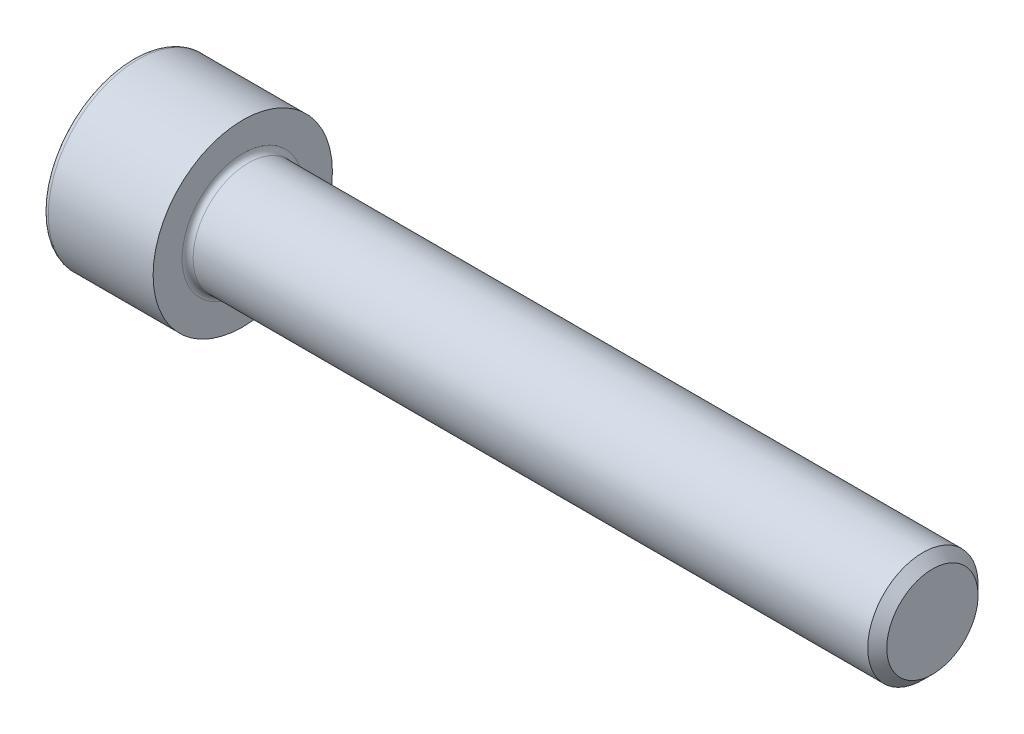
ISO-10303-21;
HEADER;
FILE_DESCRIPTION(('STEP AP214'),'2;1');
FILE_NAME('part.step','',(''),(''),'','','');
FILE_SCHEMA(('AUTOMOTIVE_DESIGN { 1 0 10303 214 1 1 1 1 }'));
ENDSEC;
DATA;
#1=APPLICATION_CONTEXT('core data for automotive mechanical design processes');
#2=APPLICATION_PROTOCOL_DEFINITION('international standard','automotive_design',2000,#1);
#3=PRODUCT_CONTEXT('',#1,'mechanical');
#4=PRODUCT('Part','Part','',(#3));
#5=PRODUCT_RELATED_PRODUCT_CATEGORY('part','',(#4));
#6=PRODUCT_DEFINITION_FORMATION('','',#4);
#7=PRODUCT_DEFINITION_CONTEXT('part definition',#1,'design');
#8=PRODUCT_DEFINITION('design','',#6,#7);
#9=PRODUCT_DEFINITION_SHAPE('','',#8);
#10=(LENGTH_UNIT() NAMED_UNIT(*) SI_UNIT(.MILLI.,.METRE.));
#11=(NAMED_UNIT(*) PLANE_ANGLE_UNIT() SI_UNIT($,.RADIAN.));
#12=(NAMED_UNIT(*) SI_UNIT($,.STERADIAN.) SOLID_ANGLE_UNIT());
#13=UNCERTAINTY_MEASURE_WITH_UNIT(LENGTH_MEASURE(1.E-05),#10,'distance_accuracy_value','');
#14=(GEOMETRIC_REPRESENTATION_CONTEXT(3) GLOBAL_UNCERTAINTY_ASSIGNED_CONTEXT((#13)) GLOBAL_UNIT_ASSIGNED_CONTEXT((#10,
#11,#12)) REPRESENTATION_CONTEXT('',''));
#15=CARTESIAN_POINT('',(0.,0.,0.));
#16=DIRECTION('',(0.,0.,1.));
#17=DIRECTION('',(1.,0.,0.));
#18=AXIS2_PLACEMENT_3D('',#15,#16,#17);
#19=CARTESIAN_POINT('',(0.,0.,0.));
#20=DIRECTION('',(-1.,0.,0.));
#21=DIRECTION('',(0.,0.,1.));
#22=AXIS2_PLACEMENT_3D('',#19,#20,#21);
#23=PLANE('',#22);
#24=DIRECTION('',(0.,-0.499999999999999,0.866025403784439));
#25=VECTOR('',#24,1.);
#26=CARTESIAN_POINT('',(0.,3.51894989071077,0.));
#27=LINE('',#26,#25);
#28=CARTESIAN_POINT('',(0.,3.51894989071077,0.));
#29=VERTEX_POINT('',#28);
#30=CARTESIAN_POINT('',(0.,1.75947494535539,3.04749999999999));
#31=VERTEX_POINT('',#30);
#32=EDGE_CURVE('E375',#29,#31,#27,.T.);
#33=ORIENTED_EDGE('',*,*,#32,.T.);
#34=DIRECTION('',(0.,1.,0.));
#35=VECTOR('',#34,1.);
#36=CARTESIAN_POINT('',(0.,-1.75947494535538,3.0475));
#37=LINE('',#36,#35);
#38=CARTESIAN_POINT('',(0.,-1.75947494535538,3.0475));
#39=VERTEX_POINT('',#38);
#40=EDGE_CURVE('E132',#39,#31,#37,.T.);
#41=ORIENTED_EDGE('',*,*,#40,.F.);
#42=DIRECTION('',(0.,-0.500000000000001,-0.866025403784438));
#43=VECTOR('',#42,1.);
#44=CARTESIAN_POINT('',(0.,-1.75947494535538,3.0475));
#45=LINE('',#44,#43);
#46=CARTESIAN_POINT('',(0.,-3.51894989071077,0.));
#47=VERTEX_POINT('',#46);
#48=EDGE_CURVE('E378',#39,#47,#45,.T.);
#49=ORIENTED_EDGE('',*,*,#48,.T.);
#50=DIRECTION('',(0.,0.499999999999999,-0.866025403784439));
#51=VECTOR('',#50,1.);
#52=CARTESIAN_POINT('',(0.,-3.51894989071077,0.));
#53=LINE('',#52,#51);
#54=CARTESIAN_POINT('',(0.,-1.75947494535539,-3.0475));
#55=VERTEX_POINT('',#54);
#56=EDGE_CURVE('E381',#47,#55,#53,.T.);
#57=ORIENTED_EDGE('',*,*,#56,.T.);
#58=DIRECTION('',(0.,-1.,0.));
#59=VECTOR('',#58,1.);
#60=CARTESIAN_POINT('',(0.,1.75947494535538,-3.04750000000001));
#61=LINE('',#60,#59);
#62=CARTESIAN_POINT('',(0.,1.75947494535538,-3.04750000000001));
#63=VERTEX_POINT('',#62);
#64=EDGE_CURVE('E384',#63,#55,#61,.T.);
#65=ORIENTED_EDGE('',*,*,#64,.F.);
#66=DIRECTION('',(0.,-0.500000000000001,-0.866025403784438));
#67=VECTOR('',#66,1.);
#68=CARTESIAN_POINT('',(0.,3.51894989071077,0.));
#69=LINE('',#68,#67);
#70=EDGE_CURVE('E127',#29,#63,#69,.T.);
#71=ORIENTED_EDGE('',*,*,#70,.F.);
#72=EDGE_LOOP('',(#33,#41,#49,#57,#65,#71));
#73=FACE_BOUND('',#72,.T.);
#74=CARTESIAN_POINT('',(0.,0.,0.));
#75=DIRECTION('',(-1.,0.,0.));
#76=DIRECTION('',(0.,0.,1.));
#77=AXIS2_PLACEMENT_3D('',#74,#75,#76);
#78=CIRCLE('',#77,6.1);
#79=CARTESIAN_POINT('',(0.,0.,6.1));
#80=VERTEX_POINT('',#79);
#81=EDGE_CURVE('E44',#80,#80,#78,.T.);
#82=ORIENTED_EDGE('',*,*,#81,.T.);
#83=EDGE_LOOP('',(#82));
#84=FACE_BOUND('',#83,.T.);
#85=ADVANCED_FACE('F36',(#73,#84),#23,.T.);
#86=CARTESIAN_POINT('',(58.,3.3095,0.));
#87=DIRECTION('',(1.,0.,0.));
#88=DIRECTION('',(0.,0.,-1.));
#89=AXIS2_PLACEMENT_3D('',#86,#87,#88);
#90=PLANE('',#89);
#91=CARTESIAN_POINT('',(58.,0.,0.));
#92=DIRECTION('',(-1.,0.,0.));
#93=DIRECTION('',(0.,0.,1.));
#94=AXIS2_PLACEMENT_3D('',#91,#92,#93);
#95=CIRCLE('',#94,3.3095);
#96=CARTESIAN_POINT('',(58.,0.,3.3095));
#97=VERTEX_POINT('',#96);
#98=EDGE_CURVE('E150',#97,#97,#95,.T.);
#99=ORIENTED_EDGE('',*,*,#98,.F.);
#100=EDGE_LOOP('',(#99));
#101=FACE_BOUND('',#100,.T.);
#102=ADVANCED_FACE('F174',(#101),#90,.T.);
#103=CARTESIAN_POINT('',(58.,0.,0.));
#104=DIRECTION('',(-1.,0.,0.));
#105=DIRECTION('',(0.,0.,1.));
#106=AXIS2_PLACEMENT_3D('',#103,#104,#105);
#107=CONICAL_SURFACE('',#106,3.3095,0.785398163397379);
#108=CARTESIAN_POINT('',(57.3095,0.,0.));
#109=DIRECTION('',(-1.,0.,0.));
#110=DIRECTION('',(0.,0.,1.));
#111=AXIS2_PLACEMENT_3D('',#108,#109,#110);
#112=CIRCLE('',#111,3.99999999999994);
#113=CARTESIAN_POINT('',(57.3095,0.,3.99999999999994));
#114=VERTEX_POINT('',#113);
#115=EDGE_CURVE('E147',#114,#114,#112,.T.);
#116=ORIENTED_EDGE('',*,*,#115,.F.);
#117=EDGE_LOOP('',(#116));
#118=FACE_BOUND('',#117,.T.);
#119=ORIENTED_EDGE('',*,*,#98,.T.);
#120=EDGE_LOOP('',(#119));
#121=FACE_BOUND('',#120,.T.);
#122=ADVANCED_FACE('F180',(#118,#121),#107,.T.);
#123=CARTESIAN_POINT('',(-31.75,0.,0.));
#124=DIRECTION('',(-1.,0.,0.));
#125=DIRECTION('',(0.,0.,1.));
#126=AXIS2_PLACEMENT_3D('',#123,#124,#125);
#127=CYLINDRICAL_SURFACE('',#126,3.99999999999997);
#128=CARTESIAN_POINT('',(8.4,0.,0.));
#129=DIRECTION('',(1.,0.,0.));
#130=DIRECTION('',(0.,0.,-1.));
#131=AXIS2_PLACEMENT_3D('',#128,#129,#130);
#132=CIRCLE('',#131,3.99999999999997);
#133=CARTESIAN_POINT('',(8.4,0.,-3.99999999999997));
#134=VERTEX_POINT('',#133);
#135=EDGE_CURVE('E156',#134,#134,#132,.T.);
#136=ORIENTED_EDGE('',*,*,#135,.T.);
#137=EDGE_LOOP('',(#136));
#138=FACE_BOUND('',#137,.T.);
#139=ORIENTED_EDGE('',*,*,#115,.T.);
#140=EDGE_LOOP('',(#139));
#141=FACE_BOUND('',#140,.T.);
#142=ADVANCED_FACE('F192',(#138,#141),#127,.T.);
#143=CARTESIAN_POINT('',(8.,6.5,0.));
#144=DIRECTION('',(1.,0.,0.));
#145=DIRECTION('',(0.,0.,-1.));
#146=AXIS2_PLACEMENT_3D('',#143,#144,#145);
#147=PLANE('',#146);
#148=CARTESIAN_POINT('',(8.,0.,0.));
#149=DIRECTION('',(1.,0.,0.));
#150=DIRECTION('',(0.,0.,-1.));
#151=AXIS2_PLACEMENT_3D('',#148,#149,#150);
#152=CIRCLE('',#151,4.39999999999997);
#153=CARTESIAN_POINT('',(8.,0.,-4.39999999999997));
#154=VERTEX_POINT('',#153);
#155=EDGE_CURVE('E153',#154,#154,#152,.F.);
#156=ORIENTED_EDGE('',*,*,#155,.T.);
#157=EDGE_LOOP('',(#156));
#158=FACE_BOUND('',#157,.T.);
#159=CARTESIAN_POINT('',(8.00000000000001,0.,0.));
#160=DIRECTION('',(-1.,0.,0.));
#161=DIRECTION('',(0.,0.,1.));
#162=AXIS2_PLACEMENT_3D('',#159,#160,#161);
#163=CIRCLE('',#162,6.5);
#164=CARTESIAN_POINT('',(8.00000000000001,0.,6.5));
#165=VERTEX_POINT('',#164);
#166=EDGE_CURVE('E143',#165,#165,#163,.T.);
#167=ORIENTED_EDGE('',*,*,#166,.F.);
#168=EDGE_LOOP('',(#167));
#169=FACE_BOUND('',#168,.T.);
#170=ADVANCED_FACE('F188',(#158,#169),#147,.T.);
#171=CARTESIAN_POINT('',(-31.75,0.,0.));
#172=DIRECTION('',(-1.,0.,0.));
#173=DIRECTION('',(0.,0.,1.));
#174=AXIS2_PLACEMENT_3D('',#171,#172,#173);
#175=CYLINDRICAL_SURFACE('',#174,6.5);
#176=CARTESIAN_POINT('',(0.399999999999998,0.,0.));
#177=DIRECTION('',(-1.,0.,0.));
#178=DIRECTION('',(0.,0.,1.));
#179=AXIS2_PLACEMENT_3D('',#176,#177,#178);
#180=CIRCLE('',#179,6.5);
#181=CARTESIAN_POINT('',(0.399999999999998,0.,6.5));
#182=VERTEX_POINT('',#181);
#183=EDGE_CURVE('E11',#182,#182,#180,.F.);
#184=ORIENTED_EDGE('',*,*,#183,.T.);
#185=EDGE_LOOP('',(#184));
#186=FACE_BOUND('',#185,.T.);
#187=ORIENTED_EDGE('',*,*,#166,.T.);
#188=EDGE_LOOP('',(#187));
#189=FACE_BOUND('',#188,.T.);
#190=ADVANCED_FACE('F170',(#186,#189),#175,.T.);
#191=CARTESIAN_POINT('',(8.4,0.,0.));
#192=DIRECTION('',(1.,0.,0.));
#193=DIRECTION('',(0.,0.,-1.));
#194=AXIS2_PLACEMENT_3D('',#191,#192,#193);
#195=TOROIDAL_SURFACE('',#194,4.39999999999997,0.4);
#196=ORIENTED_EDGE('',*,*,#135,.F.);
#197=EDGE_LOOP('',(#196));
#198=FACE_BOUND('',#197,.T.);
#199=ORIENTED_EDGE('',*,*,#155,.F.);
#200=EDGE_LOOP('',(#199));
#201=FACE_BOUND('',#200,.T.);
#202=ADVANCED_FACE('F163',(#198,#201),#195,.F.);
#203=CARTESIAN_POINT('',(0.399999999999998,0.,0.));
#204=DIRECTION('',(-1.,0.,0.));
#205=DIRECTION('',(0.,0.,1.));
#206=AXIS2_PLACEMENT_3D('',#203,#204,#205);
#207=TOROIDAL_SURFACE('',#206,6.1,0.4);
#208=ORIENTED_EDGE('',*,*,#183,.F.);
#209=EDGE_LOOP('',(#208));
#210=FACE_BOUND('',#209,.T.);
#211=ORIENTED_EDGE('',*,*,#81,.F.);
#212=EDGE_LOOP('',(#211));
#213=FACE_BOUND('',#212,.T.);
#214=ADVANCED_FACE('F38',(#210,#213),#207,.T.);
#215=CARTESIAN_POINT('',(4.,3.51894989071077,0.));
#216=DIRECTION('',(0.,-0.866025403784439,-0.499999999999999));
#217=DIRECTION('',(0.,0.499999999999999,-0.866025403784439));
#218=AXIS2_PLACEMENT_3D('',#215,#216,#217);
#219=PLANE('',#218);
#220=ORIENTED_EDGE('',*,*,#32,.F.);
#221=DIRECTION('',(-1.,0.,0.));
#222=VECTOR('',#221,1.);
#223=CARTESIAN_POINT('',(4.,3.51894989071077,0.));
#224=LINE('',#223,#222);
#225=CARTESIAN_POINT('',(4.,3.51894989071077,0.));
#226=VERTEX_POINT('',#225);
#227=EDGE_CURVE('E365',#226,#29,#224,.T.);
#228=ORIENTED_EDGE('',*,*,#227,.F.);
#229=DIRECTION('',(0.,-0.499999999999999,0.866025403784439));
#230=VECTOR('',#229,1.);
#231=CARTESIAN_POINT('',(4.,3.51894989071077,0.));
#232=LINE('',#231,#230);
#233=CARTESIAN_POINT('',(4.,2.63921241803307,1.52374999999999));
#234=VERTEX_POINT('',#233);
#235=EDGE_CURVE('E119',#226,#234,#232,.T.);
#236=ORIENTED_EDGE('',*,*,#235,.T.);
#237=CARTESIAN_POINT('',(4.,1.75947494535539,3.04749999999999));
#238=VERTEX_POINT('',#237);
#239=EDGE_CURVE('E110',#234,#238,#232,.T.);
#240=ORIENTED_EDGE('',*,*,#239,.T.);
#241=DIRECTION('',(-1.,0.,0.));
#242=VECTOR('',#241,1.);
#243=CARTESIAN_POINT('',(4.,1.75947494535539,3.04749999999999));
#244=LINE('',#243,#242);
#245=EDGE_CURVE('E124',#238,#31,#244,.T.);
#246=ORIENTED_EDGE('',*,*,#245,.T.);
#247=EDGE_LOOP('',(#220,#228,#236,#240,#246));
#248=FACE_BOUND('',#247,.T.);
#249=ADVANCED_FACE('F123',(#248),#219,.T.);
#250=CARTESIAN_POINT('',(4.,-1.75947494535538,3.0475));
#251=DIRECTION('',(0.,0.,1.));
#252=DIRECTION('',(0.,-1.,0.));
#253=AXIS2_PLACEMENT_3D('',#250,#251,#252);
#254=PLANE('',#253);
#255=ORIENTED_EDGE('',*,*,#40,.T.);
#256=ORIENTED_EDGE('',*,*,#245,.F.);
#257=DIRECTION('',(0.,1.,0.));
#258=VECTOR('',#257,1.);
#259=CARTESIAN_POINT('',(4.,-1.75947494535538,3.0475));
#260=LINE('',#259,#258);
#261=CARTESIAN_POINT('',(4.,0.,3.0475));
#262=VERTEX_POINT('',#261);
#263=EDGE_CURVE('E107',#262,#238,#260,.T.);
#264=ORIENTED_EDGE('',*,*,#263,.F.);
#265=CARTESIAN_POINT('',(4.,-1.75947494535538,3.0475));
#266=VERTEX_POINT('',#265);
#267=EDGE_CURVE('E118',#266,#262,#260,.T.);
#268=ORIENTED_EDGE('',*,*,#267,.F.);
#269=DIRECTION('',(-1.,0.,0.));
#270=VECTOR('',#269,1.);
#271=CARTESIAN_POINT('',(4.,-1.75947494535538,3.0475));
#272=LINE('',#271,#270);
#273=EDGE_CURVE('E134',#266,#39,#272,.T.);
#274=ORIENTED_EDGE('',*,*,#273,.T.);
#275=EDGE_LOOP('',(#255,#256,#264,#268,#274));
#276=FACE_BOUND('',#275,.T.);
#277=ADVANCED_FACE('F129',(#276),#254,.F.);
#278=CARTESIAN_POINT('',(4.,-1.75947494535538,3.0475));
#279=DIRECTION('',(0.,0.866025403784438,-0.500000000000001));
#280=DIRECTION('',(0.,0.500000000000001,0.866025403784438));
#281=AXIS2_PLACEMENT_3D('',#278,#279,#280);
#282=PLANE('',#281);
#283=ORIENTED_EDGE('',*,*,#48,.F.);
#284=ORIENTED_EDGE('',*,*,#273,.F.);
#285=DIRECTION('',(0.,-0.500000000000001,-0.866025403784438));
#286=VECTOR('',#285,1.);
#287=CARTESIAN_POINT('',(4.,-1.75947494535538,3.0475));
#288=LINE('',#287,#286);
#289=CARTESIAN_POINT('',(4.,-2.63921241803308,1.52375));
#290=VERTEX_POINT('',#289);
#291=EDGE_CURVE('E404',#266,#290,#288,.T.);
#292=ORIENTED_EDGE('',*,*,#291,.T.);
#293=CARTESIAN_POINT('',(4.,-3.51894989071077,0.));
#294=VERTEX_POINT('',#293);
#295=EDGE_CURVE('E393',#290,#294,#288,.T.);
#296=ORIENTED_EDGE('',*,*,#295,.T.);
#297=DIRECTION('',(-1.,0.,0.));
#298=VECTOR('',#297,1.);
#299=CARTESIAN_POINT('',(4.,-3.51894989071077,0.));
#300=LINE('',#299,#298);
#301=EDGE_CURVE('E139',#294,#47,#300,.T.);
#302=ORIENTED_EDGE('',*,*,#301,.T.);
#303=EDGE_LOOP('',(#283,#284,#292,#296,#302));
#304=FACE_BOUND('',#303,.T.);
#305=ADVANCED_FACE('F256',(#304),#282,.T.);
#306=CARTESIAN_POINT('',(4.,-3.51894989071077,0.));
#307=DIRECTION('',(0.,0.866025403784439,0.499999999999999));
#308=DIRECTION('',(0.,-0.499999999999999,0.866025403784439));
#309=AXIS2_PLACEMENT_3D('',#306,#307,#308);
#310=PLANE('',#309);
#311=ORIENTED_EDGE('',*,*,#56,.F.);
#312=ORIENTED_EDGE('',*,*,#301,.F.);
#313=DIRECTION('',(0.,0.499999999999999,-0.866025403784439));
#314=VECTOR('',#313,1.);
#315=CARTESIAN_POINT('',(4.,-3.51894989071077,0.));
#316=LINE('',#315,#314);
#317=CARTESIAN_POINT('',(4.,-2.63921241803308,-1.52375));
#318=VERTEX_POINT('',#317);
#319=EDGE_CURVE('E371',#294,#318,#316,.T.);
#320=ORIENTED_EDGE('',*,*,#319,.T.);
#321=CARTESIAN_POINT('',(4.,-1.75947494535539,-3.0475));
#322=VERTEX_POINT('',#321);
#323=EDGE_CURVE('E403',#318,#322,#316,.T.);
#324=ORIENTED_EDGE('',*,*,#323,.T.);
#325=DIRECTION('',(-1.,0.,0.));
#326=VECTOR('',#325,1.);
#327=CARTESIAN_POINT('',(4.,-1.75947494535539,-3.0475));
#328=LINE('',#327,#326);
#329=EDGE_CURVE('E364',#322,#55,#328,.T.);
#330=ORIENTED_EDGE('',*,*,#329,.T.);
#331=EDGE_LOOP('',(#311,#312,#320,#324,#330));
#332=FACE_BOUND('',#331,.T.);
#333=ADVANCED_FACE('F264',(#332),#310,.T.);
#334=CARTESIAN_POINT('',(4.,1.75947494535538,-3.04750000000001));
#335=DIRECTION('',(0.,0.,-1.));
#336=DIRECTION('',(0.,1.,0.));
#337=AXIS2_PLACEMENT_3D('',#334,#335,#336);
#338=PLANE('',#337);
#339=ORIENTED_EDGE('',*,*,#64,.T.);
#340=ORIENTED_EDGE('',*,*,#329,.F.);
#341=DIRECTION('',(0.,-1.,0.));
#342=VECTOR('',#341,1.);
#343=CARTESIAN_POINT('',(4.,1.75947494535538,-3.04750000000001));
#344=LINE('',#343,#342);
#345=CARTESIAN_POINT('',(4.,0.,-3.0475));
#346=VERTEX_POINT('',#345);
#347=EDGE_CURVE('E368',#346,#322,#344,.T.);
#348=ORIENTED_EDGE('',*,*,#347,.F.);
#349=CARTESIAN_POINT('',(4.,1.75947494535538,-3.04750000000001));
#350=VERTEX_POINT('',#349);
#351=EDGE_CURVE('E51',#350,#346,#344,.T.);
#352=ORIENTED_EDGE('',*,*,#351,.F.);
#353=DIRECTION('',(-1.,0.,0.));
#354=VECTOR('',#353,1.);
#355=CARTESIAN_POINT('',(4.,1.75947494535538,-3.04750000000001));
#356=LINE('',#355,#354);
#357=EDGE_CURVE('E361',#350,#63,#356,.T.);
#358=ORIENTED_EDGE('',*,*,#357,.T.);
#359=EDGE_LOOP('',(#339,#340,#348,#352,#358));
#360=FACE_BOUND('',#359,.T.);
#361=ADVANCED_FACE('F273',(#360),#338,.F.);
#362=CARTESIAN_POINT('',(4.,3.51894989071077,0.));
#363=DIRECTION('',(0.,0.866025403784438,-0.500000000000001));
#364=DIRECTION('',(0.,0.500000000000001,0.866025403784438));
#365=AXIS2_PLACEMENT_3D('',#362,#363,#364);
#366=PLANE('',#365);
#367=ORIENTED_EDGE('',*,*,#70,.T.);
#368=ORIENTED_EDGE('',*,*,#357,.F.);
#369=DIRECTION('',(0.,-0.500000000000001,-0.866025403784438));
#370=VECTOR('',#369,1.);
#371=CARTESIAN_POINT('',(4.,3.51894989071077,0.));
#372=LINE('',#371,#370);
#373=CARTESIAN_POINT('',(4.,2.63921241803307,-1.52375));
#374=VERTEX_POINT('',#373);
#375=EDGE_CURVE('E351',#374,#350,#372,.T.);
#376=ORIENTED_EDGE('',*,*,#375,.F.);
#377=EDGE_CURVE('E357',#226,#374,#372,.T.);
#378=ORIENTED_EDGE('',*,*,#377,.F.);
#379=ORIENTED_EDGE('',*,*,#227,.T.);
#380=EDGE_LOOP('',(#367,#368,#376,#378,#379));
#381=FACE_BOUND('',#380,.T.);
#382=ADVANCED_FACE('F282',(#381),#366,.F.);
#383=CARTESIAN_POINT('',(4.,5.27842483606615,-3.04750000000001));
#384=DIRECTION('',(1.,0.,0.));
#385=DIRECTION('',(0.,0.,-1.));
#386=AXIS2_PLACEMENT_3D('',#383,#384,#385);
#387=PLANE('',#386);
#388=ORIENTED_EDGE('',*,*,#347,.T.);
#389=ORIENTED_EDGE('',*,*,#323,.F.);
#390=CARTESIAN_POINT('',(4.,0.,0.));
#391=DIRECTION('',(-1.,0.,0.));
#392=DIRECTION('',(0.,0.,1.));
#393=AXIS2_PLACEMENT_3D('',#390,#391,#392);
#394=CIRCLE('',#393,3.0475);
#395=EDGE_CURVE('E399',#346,#318,#394,.T.);
#396=ORIENTED_EDGE('',*,*,#395,.F.);
#397=EDGE_LOOP('',(#388,#389,#396));
#398=FACE_BOUND('',#397,.T.);
#399=ADVANCED_FACE('F291',(#398),#387,.F.);
#400=ORIENTED_EDGE('',*,*,#319,.F.);
#401=ORIENTED_EDGE('',*,*,#295,.F.);
#402=EDGE_CURVE('E137',#318,#290,#394,.T.);
#403=ORIENTED_EDGE('',*,*,#402,.F.);
#404=EDGE_LOOP('',(#400,#401,#403));
#405=FACE_BOUND('',#404,.T.);
#406=ADVANCED_FACE('F300',(#405),#387,.F.);
#407=ORIENTED_EDGE('',*,*,#291,.F.);
#408=ORIENTED_EDGE('',*,*,#267,.T.);
#409=EDGE_CURVE('E133',#290,#262,#394,.T.);
#410=ORIENTED_EDGE('',*,*,#409,.F.);
#411=EDGE_LOOP('',(#407,#408,#410));
#412=FACE_BOUND('',#411,.T.);
#413=ADVANCED_FACE('F309',(#412),#387,.F.);
#414=ORIENTED_EDGE('',*,*,#263,.T.);
#415=ORIENTED_EDGE('',*,*,#239,.F.);
#416=EDGE_CURVE('E113',#262,#234,#394,.T.);
#417=ORIENTED_EDGE('',*,*,#416,.F.);
#418=EDGE_LOOP('',(#414,#415,#417));
#419=FACE_BOUND('',#418,.T.);
#420=ADVANCED_FACE('F109',(#419),#387,.F.);
#421=ORIENTED_EDGE('',*,*,#235,.F.);
#422=ORIENTED_EDGE('',*,*,#377,.T.);
#423=EDGE_CURVE('E144',#234,#374,#394,.T.);
#424=ORIENTED_EDGE('',*,*,#423,.F.);
#425=EDGE_LOOP('',(#421,#422,#424));
#426=FACE_BOUND('',#425,.T.);
#427=ADVANCED_FACE('F324',(#426),#387,.F.);
#428=ORIENTED_EDGE('',*,*,#375,.T.);
#429=ORIENTED_EDGE('',*,*,#351,.T.);
#430=EDGE_CURVE('E354',#374,#346,#394,.T.);
#431=ORIENTED_EDGE('',*,*,#430,.F.);
#432=EDGE_LOOP('',(#428,#429,#431));
#433=FACE_BOUND('',#432,.T.);
#434=ADVANCED_FACE('F239',(#433),#387,.F.);
#435=CARTESIAN_POINT('',(4.,0.,0.));
#436=DIRECTION('',(-1.,0.,0.));
#437=DIRECTION('',(0.,0.,1.));
#438=AXIS2_PLACEMENT_3D('',#435,#436,#437);
#439=CONICAL_SURFACE('',#438,3.0475,1.04719755119659);
#440=CARTESIAN_POINT('',(5.75947494535541,0.,0.));
#441=VERTEX_POINT('',#440);
#442=VERTEX_LOOP('',#441);
#443=FACE_BOUND('',#442,.T.);
#444=ORIENTED_EDGE('',*,*,#416,.T.);
#445=ORIENTED_EDGE('',*,*,#423,.T.);
#446=ORIENTED_EDGE('',*,*,#430,.T.);
#447=ORIENTED_EDGE('',*,*,#395,.T.);
#448=ORIENTED_EDGE('',*,*,#402,.T.);
#449=ORIENTED_EDGE('',*,*,#409,.T.);
#450=EDGE_LOOP('',(#444,#445,#446,#447,#448,#449));
#451=FACE_BOUND('',#450,.T.);
#452=ADVANCED_FACE('F185',(#443,#451),#439,.F.);
#453=CLOSED_SHELL('',(#85,#102,#122,#142,#170,#190,#202,#214,#249,#277,#305,#333,#361,#382,#399,
#406,#413,#420,#427,#434,#452));
#454=MANIFOLD_SOLID_BREP('B2',#453);
#455=ADVANCED_BREP_SHAPE_REPRESENTATION('',(#18,#454),#14);
#456=SHAPE_DEFINITION_REPRESENTATION(#9,#455);
ENDSEC;
END-ISO-10303-21;
